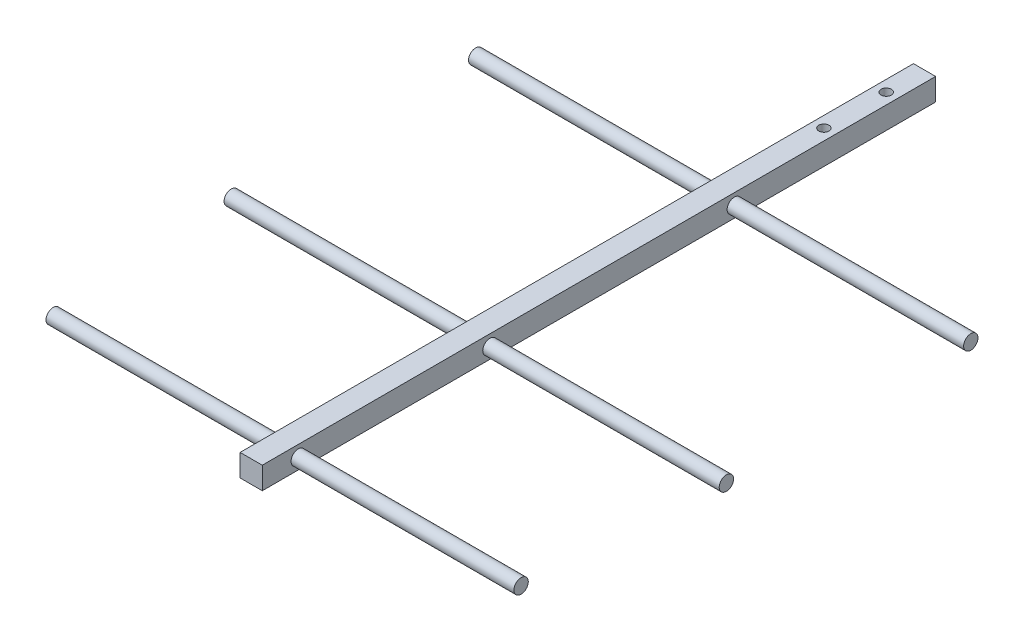
ISO-10303-21;
HEADER;
FILE_DESCRIPTION(('STEP AP214'),'2;1');
FILE_NAME('part.step','',(''),(''),'','','');
FILE_SCHEMA(('AUTOMOTIVE_DESIGN { 1 0 10303 214 1 1 1 1 }'));
ENDSEC;
DATA;
#1=APPLICATION_CONTEXT('core data for automotive mechanical design processes');
#2=APPLICATION_PROTOCOL_DEFINITION('international standard','automotive_design',2000,#1);
#3=PRODUCT_CONTEXT('',#1,'mechanical');
#4=PRODUCT('Part','Part','',(#3));
#5=PRODUCT_RELATED_PRODUCT_CATEGORY('part','',(#4));
#6=PRODUCT_DEFINITION_FORMATION('','',#4);
#7=PRODUCT_DEFINITION_CONTEXT('part definition',#1,'design');
#8=PRODUCT_DEFINITION('design','',#6,#7);
#9=PRODUCT_DEFINITION_SHAPE('','',#8);
#10=(LENGTH_UNIT() NAMED_UNIT(*) SI_UNIT(.MILLI.,.METRE.));
#11=(NAMED_UNIT(*) PLANE_ANGLE_UNIT() SI_UNIT($,.RADIAN.));
#12=(NAMED_UNIT(*) SI_UNIT($,.STERADIAN.) SOLID_ANGLE_UNIT());
#13=UNCERTAINTY_MEASURE_WITH_UNIT(LENGTH_MEASURE(1.E-05),#10,'distance_accuracy_value','');
#14=(GEOMETRIC_REPRESENTATION_CONTEXT(3) GLOBAL_UNCERTAINTY_ASSIGNED_CONTEXT((#13)) GLOBAL_UNIT_ASSIGNED_CONTEXT((#10,
#11,#12)) REPRESENTATION_CONTEXT('',''));
#15=CARTESIAN_POINT('',(0.,0.,0.));
#16=DIRECTION('',(0.,0.,1.));
#17=DIRECTION('',(1.,0.,0.));
#18=AXIS2_PLACEMENT_3D('',#15,#16,#17);
#19=CARTESIAN_POINT('',(7.3421875,7.3421875,446.0875));
#20=DIRECTION('',(-1.,0.,0.));
#21=DIRECTION('',(0.,-1.,0.));
#22=AXIS2_PLACEMENT_3D('',#19,#20,#21);
#23=PLANE('',#22);
#24=CARTESIAN_POINT('',(7.34218749999999,0.,295.275));
#25=DIRECTION('',(-1.,0.,0.));
#26=DIRECTION('',(0.,-1.,0.));
#27=AXIS2_PLACEMENT_3D('',#24,#25,#26);
#28=CIRCLE('',#27,4.76250000000001);
#29=CARTESIAN_POINT('',(7.34218749999999,-4.76250000000001,295.275));
#30=VERTEX_POINT('',#29);
#31=EDGE_CURVE('E181',#30,#30,#28,.T.);
#32=ORIENTED_EDGE('',*,*,#31,.T.);
#33=EDGE_LOOP('',(#32));
#34=FACE_BOUND('',#33,.T.);
#35=CARTESIAN_POINT('',(7.34218749999999,0.,133.35));
#36=DIRECTION('',(-1.,0.,0.));
#37=DIRECTION('',(0.,-1.,0.));
#38=AXIS2_PLACEMENT_3D('',#35,#36,#37);
#39=CIRCLE('',#38,4.76250000000001);
#40=CARTESIAN_POINT('',(7.34218749999999,-4.76250000000001,133.35));
#41=VERTEX_POINT('',#40);
#42=EDGE_CURVE('E162',#41,#41,#39,.T.);
#43=ORIENTED_EDGE('',*,*,#42,.T.);
#44=EDGE_LOOP('',(#43));
#45=FACE_BOUND('',#44,.T.);
#46=CARTESIAN_POINT('',(7.34218749999999,0.,422.275));
#47=DIRECTION('',(-1.,0.,0.));
#48=DIRECTION('',(0.,-1.,0.));
#49=AXIS2_PLACEMENT_3D('',#46,#47,#48);
#50=CIRCLE('',#49,4.76250000000001);
#51=CARTESIAN_POINT('',(7.34218749999999,-4.76250000000001,422.275));
#52=VERTEX_POINT('',#51);
#53=EDGE_CURVE('E157',#52,#52,#50,.T.);
#54=ORIENTED_EDGE('',*,*,#53,.T.);
#55=EDGE_LOOP('',(#54));
#56=FACE_BOUND('',#55,.T.);
#57=DIRECTION('',(0.,1.,0.));
#58=VECTOR('',#57,1.);
#59=CARTESIAN_POINT('',(7.3421875,7.3421875,0.));
#60=LINE('',#59,#58);
#61=CARTESIAN_POINT('',(7.3421875,-7.3421875,0.));
#62=VERTEX_POINT('',#61);
#63=CARTESIAN_POINT('',(7.3421875,7.3421875,0.));
#64=VERTEX_POINT('',#63);
#65=EDGE_CURVE('E140',#62,#64,#60,.T.);
#66=ORIENTED_EDGE('',*,*,#65,.T.);
#67=DIRECTION('',(0.,0.,-1.));
#68=VECTOR('',#67,1.);
#69=CARTESIAN_POINT('',(7.3421875,7.3421875,446.0875));
#70=LINE('',#69,#68);
#71=CARTESIAN_POINT('',(7.3421875,7.3421875,446.0875));
#72=VERTEX_POINT('',#71);
#73=EDGE_CURVE('E12',#72,#64,#70,.T.);
#74=ORIENTED_EDGE('',*,*,#73,.F.);
#75=DIRECTION('',(0.,1.,0.));
#76=VECTOR('',#75,1.);
#77=CARTESIAN_POINT('',(7.3421875,7.3421875,446.0875));
#78=LINE('',#77,#76);
#79=CARTESIAN_POINT('',(7.3421875,-7.3421875,446.0875));
#80=VERTEX_POINT('',#79);
#81=EDGE_CURVE('E126',#80,#72,#78,.T.);
#82=ORIENTED_EDGE('',*,*,#81,.F.);
#83=DIRECTION('',(0.,0.,-1.));
#84=VECTOR('',#83,1.);
#85=CARTESIAN_POINT('',(7.3421875,-7.3421875,446.0875));
#86=LINE('',#85,#84);
#87=EDGE_CURVE('E136',#80,#62,#86,.T.);
#88=ORIENTED_EDGE('',*,*,#87,.T.);
#89=EDGE_LOOP('',(#66,#74,#82,#88));
#90=FACE_BOUND('',#89,.T.);
#91=ADVANCED_FACE('F68',(#34,#45,#56,#90),#23,.F.);
#92=CARTESIAN_POINT('',(-7.3421875,7.3421875,446.0875));
#93=DIRECTION('',(0.,-1.,0.));
#94=DIRECTION('',(0.,0.,-1.));
#95=AXIS2_PLACEMENT_3D('',#92,#93,#94);
#96=PLANE('',#95);
#97=CARTESIAN_POINT('',(0.,7.3421875,25.4));
#98=DIRECTION('',(0.,1.,0.));
#99=DIRECTION('',(0.,0.,1.));
#100=AXIS2_PLACEMENT_3D('',#97,#98,#99);
#101=CIRCLE('',#100,3.3845432235855);
#102=CARTESIAN_POINT('',(0.,7.3421875,28.7845432235855));
#103=VERTEX_POINT('',#102);
#104=EDGE_CURVE('E195',#103,#103,#101,.T.);
#105=ORIENTED_EDGE('',*,*,#104,.F.);
#106=EDGE_LOOP('',(#105));
#107=FACE_BOUND('',#106,.T.);
#108=CARTESIAN_POINT('',(0.,7.3421875,66.675));
#109=DIRECTION('',(0.,1.,0.));
#110=DIRECTION('',(0.,0.,1.));
#111=AXIS2_PLACEMENT_3D('',#108,#109,#110);
#112=CIRCLE('',#111,3.38454322358549);
#113=CARTESIAN_POINT('',(0.,7.3421875,70.0595432235855));
#114=VERTEX_POINT('',#113);
#115=EDGE_CURVE('E199',#114,#114,#112,.T.);
#116=ORIENTED_EDGE('',*,*,#115,.F.);
#117=EDGE_LOOP('',(#116));
#118=FACE_BOUND('',#117,.T.);
#119=DIRECTION('',(-1.,0.,0.));
#120=VECTOR('',#119,1.);
#121=CARTESIAN_POINT('',(-7.3421875,7.3421875,0.));
#122=LINE('',#121,#120);
#123=CARTESIAN_POINT('',(-7.3421875,7.3421875,0.));
#124=VERTEX_POINT('',#123);
#125=EDGE_CURVE('E130',#64,#124,#122,.T.);
#126=ORIENTED_EDGE('',*,*,#125,.T.);
#127=DIRECTION('',(0.,0.,-1.));
#128=VECTOR('',#127,1.);
#129=CARTESIAN_POINT('',(-7.3421875,7.3421875,446.0875));
#130=LINE('',#129,#128);
#131=CARTESIAN_POINT('',(-7.3421875,7.3421875,446.0875));
#132=VERTEX_POINT('',#131);
#133=EDGE_CURVE('E78',#132,#124,#130,.T.);
#134=ORIENTED_EDGE('',*,*,#133,.F.);
#135=DIRECTION('',(-1.,0.,0.));
#136=VECTOR('',#135,1.);
#137=CARTESIAN_POINT('',(-7.3421875,7.3421875,446.0875));
#138=LINE('',#137,#136);
#139=EDGE_CURVE('E121',#72,#132,#138,.T.);
#140=ORIENTED_EDGE('',*,*,#139,.F.);
#141=ORIENTED_EDGE('',*,*,#73,.T.);
#142=EDGE_LOOP('',(#126,#134,#140,#141));
#143=FACE_BOUND('',#142,.T.);
#144=ADVANCED_FACE('F129',(#107,#118,#143),#96,.F.);
#145=CARTESIAN_POINT('',(-7.3421875,7.3421875,446.0875));
#146=DIRECTION('',(1.,0.,0.));
#147=DIRECTION('',(0.,1.,0.));
#148=AXIS2_PLACEMENT_3D('',#145,#146,#147);
#149=PLANE('',#148);
#150=CARTESIAN_POINT('',(-7.34218750000001,0.,295.275));
#151=DIRECTION('',(1.,0.,0.));
#152=DIRECTION('',(0.,1.,0.));
#153=AXIS2_PLACEMENT_3D('',#150,#151,#152);
#154=CIRCLE('',#153,4.76250000000001);
#155=CARTESIAN_POINT('',(-7.34218750000001,4.76250000000001,295.275));
#156=VERTEX_POINT('',#155);
#157=EDGE_CURVE('E71',#156,#156,#154,.T.);
#158=ORIENTED_EDGE('',*,*,#157,.T.);
#159=EDGE_LOOP('',(#158));
#160=FACE_BOUND('',#159,.T.);
#161=CARTESIAN_POINT('',(-7.34218750000001,0.,133.35));
#162=DIRECTION('',(1.,0.,0.));
#163=DIRECTION('',(0.,1.,0.));
#164=AXIS2_PLACEMENT_3D('',#161,#162,#163);
#165=CIRCLE('',#164,4.76250000000001);
#166=CARTESIAN_POINT('',(-7.34218750000001,4.76250000000001,133.35));
#167=VERTEX_POINT('',#166);
#168=EDGE_CURVE('E159',#167,#167,#165,.T.);
#169=ORIENTED_EDGE('',*,*,#168,.T.);
#170=EDGE_LOOP('',(#169));
#171=FACE_BOUND('',#170,.T.);
#172=CARTESIAN_POINT('',(-7.34218750000001,0.,422.275));
#173=DIRECTION('',(1.,0.,0.));
#174=DIRECTION('',(0.,1.,0.));
#175=AXIS2_PLACEMENT_3D('',#172,#173,#174);
#176=CIRCLE('',#175,4.76250000000001);
#177=CARTESIAN_POINT('',(-7.34218750000001,4.76250000000001,422.275));
#178=VERTEX_POINT('',#177);
#179=EDGE_CURVE('E155',#178,#178,#176,.T.);
#180=ORIENTED_EDGE('',*,*,#179,.T.);
#181=EDGE_LOOP('',(#180));
#182=FACE_BOUND('',#181,.T.);
#183=DIRECTION('',(0.,-1.,0.));
#184=VECTOR('',#183,1.);
#185=CARTESIAN_POINT('',(-7.3421875,7.3421875,0.));
#186=LINE('',#185,#184);
#187=CARTESIAN_POINT('',(-7.3421875,-7.3421875,0.));
#188=VERTEX_POINT('',#187);
#189=EDGE_CURVE('E107',#124,#188,#186,.T.);
#190=ORIENTED_EDGE('',*,*,#189,.T.);
#191=DIRECTION('',(0.,0.,-1.));
#192=VECTOR('',#191,1.);
#193=CARTESIAN_POINT('',(-7.3421875,-7.3421875,446.0875));
#194=LINE('',#193,#192);
#195=CARTESIAN_POINT('',(-7.3421875,-7.3421875,446.0875));
#196=VERTEX_POINT('',#195);
#197=EDGE_CURVE('E132',#196,#188,#194,.T.);
#198=ORIENTED_EDGE('',*,*,#197,.F.);
#199=DIRECTION('',(0.,-1.,0.));
#200=VECTOR('',#199,1.);
#201=CARTESIAN_POINT('',(-7.3421875,7.3421875,446.0875));
#202=LINE('',#201,#200);
#203=EDGE_CURVE('E124',#132,#196,#202,.T.);
#204=ORIENTED_EDGE('',*,*,#203,.F.);
#205=ORIENTED_EDGE('',*,*,#133,.T.);
#206=EDGE_LOOP('',(#190,#198,#204,#205));
#207=FACE_BOUND('',#206,.T.);
#208=ADVANCED_FACE('F134',(#160,#171,#182,#207),#149,.F.);
#209=CARTESIAN_POINT('',(-7.3421875,-7.3421875,446.0875));
#210=DIRECTION('',(0.,1.,0.));
#211=DIRECTION('',(0.,0.,1.));
#212=AXIS2_PLACEMENT_3D('',#209,#210,#211);
#213=PLANE('',#212);
#214=CARTESIAN_POINT('',(0.,-7.3421875,25.4));
#215=DIRECTION('',(0.,1.,0.));
#216=DIRECTION('',(0.,0.,1.));
#217=AXIS2_PLACEMENT_3D('',#214,#215,#216);
#218=CIRCLE('',#217,3.3845432235855);
#219=CARTESIAN_POINT('',(0.,-7.3421875,28.7845432235855));
#220=VERTEX_POINT('',#219);
#221=EDGE_CURVE('E144',#220,#220,#218,.T.);
#222=ORIENTED_EDGE('',*,*,#221,.T.);
#223=EDGE_LOOP('',(#222));
#224=FACE_BOUND('',#223,.T.);
#225=CARTESIAN_POINT('',(0.,-7.3421875,66.675));
#226=DIRECTION('',(0.,1.,0.));
#227=DIRECTION('',(0.,0.,1.));
#228=AXIS2_PLACEMENT_3D('',#225,#226,#227);
#229=CIRCLE('',#228,3.38454322358549);
#230=CARTESIAN_POINT('',(0.,-7.3421875,70.0595432235855));
#231=VERTEX_POINT('',#230);
#232=EDGE_CURVE('E191',#231,#231,#229,.T.);
#233=ORIENTED_EDGE('',*,*,#232,.T.);
#234=EDGE_LOOP('',(#233));
#235=FACE_BOUND('',#234,.T.);
#236=DIRECTION('',(1.,0.,0.));
#237=VECTOR('',#236,1.);
#238=CARTESIAN_POINT('',(-7.3421875,-7.3421875,0.));
#239=LINE('',#238,#237);
#240=EDGE_CURVE('E114',#188,#62,#239,.T.);
#241=ORIENTED_EDGE('',*,*,#240,.T.);
#242=ORIENTED_EDGE('',*,*,#87,.F.);
#243=DIRECTION('',(1.,0.,0.));
#244=VECTOR('',#243,1.);
#245=CARTESIAN_POINT('',(-7.3421875,-7.3421875,446.0875));
#246=LINE('',#245,#244);
#247=EDGE_CURVE('E87',#196,#80,#246,.T.);
#248=ORIENTED_EDGE('',*,*,#247,.F.);
#249=ORIENTED_EDGE('',*,*,#197,.T.);
#250=EDGE_LOOP('',(#241,#242,#248,#249));
#251=FACE_BOUND('',#250,.T.);
#252=ADVANCED_FACE('F205',(#224,#235,#251),#213,.F.);
#253=CARTESIAN_POINT('',(0.,0.,446.0875));
#254=DIRECTION('',(0.,0.,1.));
#255=DIRECTION('',(1.,0.,0.));
#256=AXIS2_PLACEMENT_3D('',#253,#254,#255);
#257=PLANE('',#256);
#258=ORIENTED_EDGE('',*,*,#81,.T.);
#259=ORIENTED_EDGE('',*,*,#139,.T.);
#260=ORIENTED_EDGE('',*,*,#203,.T.);
#261=ORIENTED_EDGE('',*,*,#247,.T.);
#262=EDGE_LOOP('',(#258,#259,#260,#261));
#263=FACE_BOUND('',#262,.T.);
#264=ADVANCED_FACE('F122',(#263),#257,.T.);
#265=CARTESIAN_POINT('',(0.,0.,0.));
#266=DIRECTION('',(0.,0.,1.));
#267=DIRECTION('',(1.,0.,0.));
#268=AXIS2_PLACEMENT_3D('',#265,#266,#267);
#269=PLANE('',#268);
#270=ORIENTED_EDGE('',*,*,#65,.F.);
#271=ORIENTED_EDGE('',*,*,#240,.F.);
#272=ORIENTED_EDGE('',*,*,#189,.F.);
#273=ORIENTED_EDGE('',*,*,#125,.F.);
#274=EDGE_LOOP('',(#270,#271,#272,#273));
#275=FACE_BOUND('',#274,.T.);
#276=ADVANCED_FACE('F211',(#275),#269,.F.);
#277=CARTESIAN_POINT('',(0.,-7.3421875,66.675));
#278=DIRECTION('',(0.,1.,0.));
#279=DIRECTION('',(0.,0.,1.));
#280=AXIS2_PLACEMENT_3D('',#277,#278,#279);
#281=CYLINDRICAL_SURFACE('',#280,3.38454322358549);
#282=ORIENTED_EDGE('',*,*,#232,.F.);
#283=EDGE_LOOP('',(#282));
#284=FACE_BOUND('',#283,.T.);
#285=ORIENTED_EDGE('',*,*,#115,.T.);
#286=EDGE_LOOP('',(#285));
#287=FACE_BOUND('',#286,.T.);
#288=ADVANCED_FACE('F207',(#284,#287),#281,.F.);
#289=CARTESIAN_POINT('',(0.,-7.3421875,25.4));
#290=DIRECTION('',(0.,1.,0.));
#291=DIRECTION('',(0.,0.,1.));
#292=AXIS2_PLACEMENT_3D('',#289,#290,#291);
#293=CYLINDRICAL_SURFACE('',#292,3.3845432235855);
#294=ORIENTED_EDGE('',*,*,#221,.F.);
#295=EDGE_LOOP('',(#294));
#296=FACE_BOUND('',#295,.T.);
#297=ORIENTED_EDGE('',*,*,#104,.T.);
#298=EDGE_LOOP('',(#297));
#299=FACE_BOUND('',#298,.T.);
#300=ADVANCED_FACE('F210',(#296,#299),#293,.F.);
#301=CARTESIAN_POINT('',(-155.,0.,0.));
#302=DIRECTION('',(1.,0.,0.));
#303=DIRECTION('',(0.,0.,-1.));
#304=AXIS2_PLACEMENT_3D('',#301,#302,#303);
#305=PLANE('',#304);
#306=CARTESIAN_POINT('',(-155.,0.,422.275));
#307=DIRECTION('',(1.,0.,0.));
#308=DIRECTION('',(0.,0.,-1.));
#309=AXIS2_PLACEMENT_3D('',#306,#307,#308);
#310=CIRCLE('',#309,4.76250000000001);
#311=CARTESIAN_POINT('',(-155.,0.,417.5125));
#312=VERTEX_POINT('',#311);
#313=EDGE_CURVE('E158',#312,#312,#310,.T.);
#314=ORIENTED_EDGE('',*,*,#313,.F.);
#315=EDGE_LOOP('',(#314));
#316=FACE_BOUND('',#315,.T.);
#317=ADVANCED_FACE('F238',(#316),#305,.F.);
#318=CARTESIAN_POINT('',(-155.,0.,422.275));
#319=DIRECTION('',(1.,0.,0.));
#320=DIRECTION('',(0.,0.,-1.));
#321=AXIS2_PLACEMENT_3D('',#318,#319,#320);
#322=CYLINDRICAL_SURFACE('',#321,4.76250000000001);
#323=ORIENTED_EDGE('',*,*,#313,.T.);
#324=EDGE_LOOP('',(#323));
#325=FACE_BOUND('',#324,.T.);
#326=ORIENTED_EDGE('',*,*,#179,.F.);
#327=EDGE_LOOP('',(#326));
#328=FACE_BOUND('',#327,.T.);
#329=ADVANCED_FACE('F244',(#325,#328),#322,.T.);
#330=CARTESIAN_POINT('',(155.,0.,422.275));
#331=DIRECTION('',(1.,0.,0.));
#332=DIRECTION('',(0.,0.,-1.));
#333=AXIS2_PLACEMENT_3D('',#330,#331,#332);
#334=CIRCLE('',#333,4.76250000000001);
#335=CARTESIAN_POINT('',(155.,0.,417.5125));
#336=VERTEX_POINT('',#335);
#337=EDGE_CURVE('E169',#336,#336,#334,.T.);
#338=ORIENTED_EDGE('',*,*,#337,.F.);
#339=EDGE_LOOP('',(#338));
#340=FACE_BOUND('',#339,.T.);
#341=ORIENTED_EDGE('',*,*,#53,.F.);
#342=EDGE_LOOP('',(#341));
#343=FACE_BOUND('',#342,.T.);
#344=ADVANCED_FACE('F240',(#340,#343),#322,.T.);
#345=CARTESIAN_POINT('',(155.,0.,0.));
#346=DIRECTION('',(1.,0.,0.));
#347=DIRECTION('',(0.,0.,-1.));
#348=AXIS2_PLACEMENT_3D('',#345,#346,#347);
#349=PLANE('',#348);
#350=ORIENTED_EDGE('',*,*,#337,.T.);
#351=EDGE_LOOP('',(#350));
#352=FACE_BOUND('',#351,.T.);
#353=ADVANCED_FACE('F243',(#352),#349,.T.);
#354=CARTESIAN_POINT('',(-164.,0.,0.));
#355=DIRECTION('',(1.,0.,0.));
#356=DIRECTION('',(0.,0.,-1.));
#357=AXIS2_PLACEMENT_3D('',#354,#355,#356);
#358=PLANE('',#357);
#359=CARTESIAN_POINT('',(-164.,0.,133.35));
#360=DIRECTION('',(1.,0.,0.));
#361=DIRECTION('',(0.,0.,-1.));
#362=AXIS2_PLACEMENT_3D('',#359,#360,#361);
#363=CIRCLE('',#362,4.76250000000001);
#364=CARTESIAN_POINT('',(-164.,0.,128.5875));
#365=VERTEX_POINT('',#364);
#366=EDGE_CURVE('E163',#365,#365,#363,.T.);
#367=ORIENTED_EDGE('',*,*,#366,.F.);
#368=EDGE_LOOP('',(#367));
#369=FACE_BOUND('',#368,.T.);
#370=ADVANCED_FACE('F251',(#369),#358,.F.);
#371=CARTESIAN_POINT('',(-164.,0.,133.35));
#372=DIRECTION('',(1.,0.,0.));
#373=DIRECTION('',(0.,0.,-1.));
#374=AXIS2_PLACEMENT_3D('',#371,#372,#373);
#375=CYLINDRICAL_SURFACE('',#374,4.76250000000001);
#376=ORIENTED_EDGE('',*,*,#366,.T.);
#377=EDGE_LOOP('',(#376));
#378=FACE_BOUND('',#377,.T.);
#379=ORIENTED_EDGE('',*,*,#168,.F.);
#380=EDGE_LOOP('',(#379));
#381=FACE_BOUND('',#380,.T.);
#382=ADVANCED_FACE('F257',(#378,#381),#375,.T.);
#383=CARTESIAN_POINT('',(164.,0.,133.35));
#384=DIRECTION('',(1.,0.,0.));
#385=DIRECTION('',(0.,0.,-1.));
#386=AXIS2_PLACEMENT_3D('',#383,#384,#385);
#387=CIRCLE('',#386,4.76250000000001);
#388=CARTESIAN_POINT('',(164.,0.,128.5875));
#389=VERTEX_POINT('',#388);
#390=EDGE_CURVE('E173',#389,#389,#387,.T.);
#391=ORIENTED_EDGE('',*,*,#390,.F.);
#392=EDGE_LOOP('',(#391));
#393=FACE_BOUND('',#392,.T.);
#394=ORIENTED_EDGE('',*,*,#42,.F.);
#395=EDGE_LOOP('',(#394));
#396=FACE_BOUND('',#395,.T.);
#397=ADVANCED_FACE('F253',(#393,#396),#375,.T.);
#398=CARTESIAN_POINT('',(164.,0.,0.));
#399=DIRECTION('',(1.,0.,0.));
#400=DIRECTION('',(0.,0.,-1.));
#401=AXIS2_PLACEMENT_3D('',#398,#399,#400);
#402=PLANE('',#401);
#403=ORIENTED_EDGE('',*,*,#390,.T.);
#404=EDGE_LOOP('',(#403));
#405=FACE_BOUND('',#404,.T.);
#406=ADVANCED_FACE('F256',(#405),#402,.T.);
#407=CARTESIAN_POINT('',(-164.,0.,0.));
#408=DIRECTION('',(1.,0.,0.));
#409=DIRECTION('',(0.,0.,-1.));
#410=AXIS2_PLACEMENT_3D('',#407,#408,#409);
#411=PLANE('',#410);
#412=CARTESIAN_POINT('',(-164.,0.,295.275));
#413=DIRECTION('',(1.,0.,0.));
#414=DIRECTION('',(0.,0.,-1.));
#415=AXIS2_PLACEMENT_3D('',#412,#413,#414);
#416=CIRCLE('',#415,4.76250000000001);
#417=CARTESIAN_POINT('',(-164.,0.,290.5125));
#418=VERTEX_POINT('',#417);
#419=EDGE_CURVE('E283',#418,#418,#416,.T.);
#420=ORIENTED_EDGE('',*,*,#419,.F.);
#421=EDGE_LOOP('',(#420));
#422=FACE_BOUND('',#421,.T.);
#423=ADVANCED_FACE('F264',(#422),#411,.F.);
#424=CARTESIAN_POINT('',(-164.,0.,295.275));
#425=DIRECTION('',(1.,0.,0.));
#426=DIRECTION('',(0.,0.,-1.));
#427=AXIS2_PLACEMENT_3D('',#424,#425,#426);
#428=CYLINDRICAL_SURFACE('',#427,4.76250000000001);
#429=ORIENTED_EDGE('',*,*,#419,.T.);
#430=EDGE_LOOP('',(#429));
#431=FACE_BOUND('',#430,.T.);
#432=ORIENTED_EDGE('',*,*,#157,.F.);
#433=EDGE_LOOP('',(#432));
#434=FACE_BOUND('',#433,.T.);
#435=ADVANCED_FACE('F270',(#431,#434),#428,.T.);
#436=CARTESIAN_POINT('',(164.,0.,295.275));
#437=DIRECTION('',(1.,0.,0.));
#438=DIRECTION('',(0.,0.,-1.));
#439=AXIS2_PLACEMENT_3D('',#436,#437,#438);
#440=CIRCLE('',#439,4.76250000000001);
#441=CARTESIAN_POINT('',(164.,0.,290.5125));
#442=VERTEX_POINT('',#441);
#443=EDGE_CURVE('E282',#442,#442,#440,.T.);
#444=ORIENTED_EDGE('',*,*,#443,.F.);
#445=EDGE_LOOP('',(#444));
#446=FACE_BOUND('',#445,.T.);
#447=ORIENTED_EDGE('',*,*,#31,.F.);
#448=EDGE_LOOP('',(#447));
#449=FACE_BOUND('',#448,.T.);
#450=ADVANCED_FACE('F266',(#446,#449),#428,.T.);
#451=CARTESIAN_POINT('',(164.,0.,0.));
#452=DIRECTION('',(1.,0.,0.));
#453=DIRECTION('',(0.,0.,-1.));
#454=AXIS2_PLACEMENT_3D('',#451,#452,#453);
#455=PLANE('',#454);
#456=ORIENTED_EDGE('',*,*,#443,.T.);
#457=EDGE_LOOP('',(#456));
#458=FACE_BOUND('',#457,.T.);
#459=ADVANCED_FACE('F269',(#458),#455,.T.);
#460=CLOSED_SHELL('',(#91,#144,#208,#252,#264,#276,#288,#300,#317,#329,#344,#353,#370,#382,#397,
#406,#423,#435,#450,#459));
#461=MANIFOLD_SOLID_BREP('B2',#460);
#462=ADVANCED_BREP_SHAPE_REPRESENTATION('',(#18,#461),#14);
#463=SHAPE_DEFINITION_REPRESENTATION(#9,#462);
ENDSEC;
END-ISO-10303-21;
